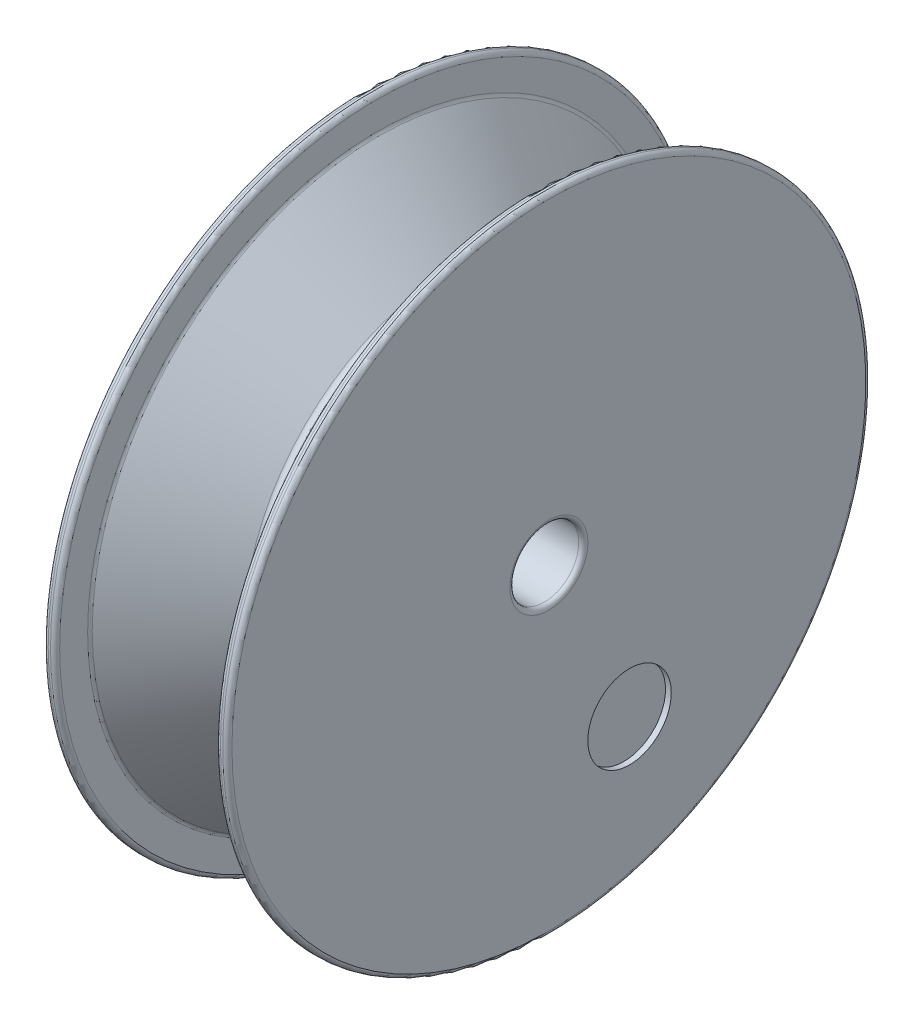
ISO-10303-21;
HEADER;
FILE_DESCRIPTION(('STEP AP214'),'2;1');
FILE_NAME('part.step','',(''),(''),'','','');
FILE_SCHEMA(('AUTOMOTIVE_DESIGN { 1 0 10303 214 1 1 1 1 }'));
ENDSEC;
DATA;
#1=APPLICATION_CONTEXT('core data for automotive mechanical design processes');
#2=APPLICATION_PROTOCOL_DEFINITION('international standard','automotive_design',2000,#1);
#3=PRODUCT_CONTEXT('',#1,'mechanical');
#4=PRODUCT('Part','Part','',(#3));
#5=PRODUCT_RELATED_PRODUCT_CATEGORY('part','',(#4));
#6=PRODUCT_DEFINITION_FORMATION('','',#4);
#7=PRODUCT_DEFINITION_CONTEXT('part definition',#1,'design');
#8=PRODUCT_DEFINITION('design','',#6,#7);
#9=PRODUCT_DEFINITION_SHAPE('','',#8);
#10=(LENGTH_UNIT() NAMED_UNIT(*) SI_UNIT(.MILLI.,.METRE.));
#11=(NAMED_UNIT(*) PLANE_ANGLE_UNIT() SI_UNIT($,.RADIAN.));
#12=(NAMED_UNIT(*) SI_UNIT($,.STERADIAN.) SOLID_ANGLE_UNIT());
#13=UNCERTAINTY_MEASURE_WITH_UNIT(LENGTH_MEASURE(1.E-05),#10,'distance_accuracy_value','');
#14=(GEOMETRIC_REPRESENTATION_CONTEXT(3) GLOBAL_UNCERTAINTY_ASSIGNED_CONTEXT((#13)) GLOBAL_UNIT_ASSIGNED_CONTEXT((#10,
#11,#12)) REPRESENTATION_CONTEXT('',''));
#15=CARTESIAN_POINT('',(0.,0.,0.));
#16=DIRECTION('',(0.,0.,1.));
#17=DIRECTION('',(1.,0.,0.));
#18=AXIS2_PLACEMENT_3D('',#15,#16,#17);
#19=CARTESIAN_POINT('',(0.,0.,0.));
#20=DIRECTION('',(-1.,0.,0.));
#21=DIRECTION('',(0.,0.,1.));
#22=AXIS2_PLACEMENT_3D('',#19,#20,#21);
#23=CYLINDRICAL_SURFACE('',#22,1.5);
#24=CARTESIAN_POINT('',(3.8,0.,0.));
#25=DIRECTION('',(-1.,0.,0.));
#26=DIRECTION('',(0.,0.,1.));
#27=AXIS2_PLACEMENT_3D('',#24,#25,#26);
#28=CIRCLE('',#27,1.5);
#29=CARTESIAN_POINT('',(3.8,0.,1.5));
#30=VERTEX_POINT('',#29);
#31=EDGE_CURVE('E41',#30,#30,#28,.F.);
#32=ORIENTED_EDGE('',*,*,#31,.T.);
#33=EDGE_LOOP('',(#32));
#34=FACE_BOUND('',#33,.T.);
#35=CARTESIAN_POINT('',(-3.8,0.,0.));
#36=DIRECTION('',(1.,0.,0.));
#37=DIRECTION('',(0.,0.,-1.));
#38=AXIS2_PLACEMENT_3D('',#35,#36,#37);
#39=CIRCLE('',#38,1.5);
#40=CARTESIAN_POINT('',(-3.8,0.,-1.5));
#41=VERTEX_POINT('',#40);
#42=EDGE_CURVE('E45',#41,#41,#39,.F.);
#43=ORIENTED_EDGE('',*,*,#42,.T.);
#44=EDGE_LOOP('',(#43));
#45=FACE_BOUND('',#44,.T.);
#46=ADVANCED_FACE('F31',(#34,#45),#23,.F.);
#47=CARTESIAN_POINT('',(-4.,1.5,0.));
#48=DIRECTION('',(1.,0.,0.));
#49=DIRECTION('',(0.,0.,-1.));
#50=AXIS2_PLACEMENT_3D('',#47,#48,#49);
#51=PLANE('',#50);
#52=CARTESIAN_POINT('',(-4.,0.,0.));
#53=DIRECTION('',(1.,0.,0.));
#54=DIRECTION('',(0.,0.,-1.));
#55=AXIS2_PLACEMENT_3D('',#52,#53,#54);
#56=CIRCLE('',#55,13.8);
#57=CARTESIAN_POINT('',(-4.,0.,-13.8));
#58=VERTEX_POINT('',#57);
#59=EDGE_CURVE('E10',#58,#58,#56,.F.);
#60=ORIENTED_EDGE('',*,*,#59,.T.);
#61=EDGE_LOOP('',(#60));
#62=FACE_BOUND('',#61,.T.);
#63=CARTESIAN_POINT('',(-4.,0.,0.));
#64=DIRECTION('',(1.,0.,0.));
#65=DIRECTION('',(0.,0.,-1.));
#66=AXIS2_PLACEMENT_3D('',#63,#64,#65);
#67=CIRCLE('',#66,1.7);
#68=CARTESIAN_POINT('',(-4.,0.,-1.7));
#69=VERTEX_POINT('',#68);
#70=EDGE_CURVE('E37',#69,#69,#67,.T.);
#71=ORIENTED_EDGE('',*,*,#70,.T.);
#72=EDGE_LOOP('',(#71));
#73=FACE_BOUND('',#72,.T.);
#74=ADVANCED_FACE('F130',(#62,#73),#51,.F.);
#75=CARTESIAN_POINT('',(0.,0.,0.));
#76=DIRECTION('',(-1.,0.,0.));
#77=DIRECTION('',(0.,0.,1.));
#78=AXIS2_PLACEMENT_3D('',#75,#76,#77);
#79=CYLINDRICAL_SURFACE('',#78,14.);
#80=CARTESIAN_POINT('',(-3.7,0.,0.));
#81=DIRECTION('',(-1.,0.,0.));
#82=DIRECTION('',(0.,0.,1.));
#83=AXIS2_PLACEMENT_3D('',#80,#81,#82);
#84=CIRCLE('',#83,14.);
#85=CARTESIAN_POINT('',(-3.7,0.,14.));
#86=VERTEX_POINT('',#85);
#87=EDGE_CURVE('E56',#86,#86,#84,.T.);
#88=ORIENTED_EDGE('',*,*,#87,.T.);
#89=EDGE_LOOP('',(#88));
#90=FACE_BOUND('',#89,.T.);
#91=CARTESIAN_POINT('',(-3.8,0.,0.));
#92=DIRECTION('',(1.,0.,0.));
#93=DIRECTION('',(0.,0.,-1.));
#94=AXIS2_PLACEMENT_3D('',#91,#92,#93);
#95=CIRCLE('',#94,14.);
#96=CARTESIAN_POINT('',(-3.8,0.,-14.));
#97=VERTEX_POINT('',#96);
#98=EDGE_CURVE('E59',#97,#97,#95,.T.);
#99=ORIENTED_EDGE('',*,*,#98,.T.);
#100=EDGE_LOOP('',(#99));
#101=FACE_BOUND('',#100,.T.);
#102=ADVANCED_FACE('F135',(#90,#101),#79,.T.);
#103=CARTESIAN_POINT('',(-3.5,14.,0.));
#104=DIRECTION('',(-1.,0.,0.));
#105=DIRECTION('',(0.,0.,1.));
#106=AXIS2_PLACEMENT_3D('',#103,#104,#105);
#107=PLANE('',#106);
#108=CARTESIAN_POINT('',(-3.5,0.,0.));
#109=DIRECTION('',(-1.,0.,0.));
#110=DIRECTION('',(0.,0.,1.));
#111=AXIS2_PLACEMENT_3D('',#108,#109,#110);
#112=CIRCLE('',#111,12.5828427124746);
#113=CARTESIAN_POINT('',(-3.5,0.,12.5828427124746));
#114=VERTEX_POINT('',#113);
#115=EDGE_CURVE('E62',#114,#114,#112,.T.);
#116=ORIENTED_EDGE('',*,*,#115,.T.);
#117=EDGE_LOOP('',(#116));
#118=FACE_BOUND('',#117,.T.);
#119=CARTESIAN_POINT('',(-3.5,0.,0.));
#120=DIRECTION('',(-1.,0.,0.));
#121=DIRECTION('',(0.,0.,1.));
#122=AXIS2_PLACEMENT_3D('',#119,#120,#121);
#123=CIRCLE('',#122,13.8);
#124=CARTESIAN_POINT('',(-3.5,0.,13.8));
#125=VERTEX_POINT('',#124);
#126=EDGE_CURVE('E65',#125,#125,#123,.F.);
#127=ORIENTED_EDGE('',*,*,#126,.T.);
#128=EDGE_LOOP('',(#127));
#129=FACE_BOUND('',#128,.T.);
#130=ADVANCED_FACE('F196',(#118,#129),#107,.F.);
#131=CARTESIAN_POINT('',(0.,0.,0.));
#132=DIRECTION('',(-1.,0.,0.));
#133=DIRECTION('',(0.,0.,1.));
#134=AXIS2_PLACEMENT_3D('',#131,#132,#133);
#135=CONICAL_SURFACE('',#134,9.,0.785398163397452);
#136=CARTESIAN_POINT('',(-0.141421356237334,0.,0.));
#137=DIRECTION('',(-1.,0.,0.));
#138=DIRECTION('',(0.,0.,1.));
#139=AXIS2_PLACEMENT_3D('',#136,#137,#138);
#140=CIRCLE('',#139,9.14142135623731);
#141=CARTESIAN_POINT('',(-0.141421356237334,0.,9.14142135623731));
#142=VERTEX_POINT('',#141);
#143=EDGE_CURVE('E68',#142,#142,#140,.T.);
#144=ORIENTED_EDGE('',*,*,#143,.T.);
#145=EDGE_LOOP('',(#144));
#146=FACE_BOUND('',#145,.T.);
#147=CARTESIAN_POINT('',(-3.44142135623731,0.,0.));
#148=DIRECTION('',(-1.,0.,0.));
#149=DIRECTION('',(0.,0.,1.));
#150=AXIS2_PLACEMENT_3D('',#147,#148,#149);
#151=CIRCLE('',#150,12.4414213562373);
#152=CARTESIAN_POINT('',(-3.44142135623731,0.,12.4414213562373));
#153=VERTEX_POINT('',#152);
#154=EDGE_CURVE('E71',#153,#153,#151,.F.);
#155=ORIENTED_EDGE('',*,*,#154,.T.);
#156=EDGE_LOOP('',(#155));
#157=FACE_BOUND('',#156,.T.);
#158=ADVANCED_FACE('F188',(#146,#157),#135,.T.);
#159=CARTESIAN_POINT('',(3.5,0.,0.));
#160=DIRECTION('',(1.,0.,0.));
#161=DIRECTION('',(0.,0.,-1.));
#162=AXIS2_PLACEMENT_3D('',#159,#160,#161);
#163=CONICAL_SURFACE('',#162,12.5,0.785398163397445);
#164=CARTESIAN_POINT('',(3.4414213562373,0.,0.));
#165=DIRECTION('',(1.,0.,0.));
#166=DIRECTION('',(0.,0.,-1.));
#167=AXIS2_PLACEMENT_3D('',#164,#165,#166);
#168=CIRCLE('',#167,12.4414213562373);
#169=CARTESIAN_POINT('',(3.4414213562373,0.,-12.4414213562373));
#170=VERTEX_POINT('',#169);
#171=EDGE_CURVE('E74',#170,#170,#168,.F.);
#172=ORIENTED_EDGE('',*,*,#171,.T.);
#173=EDGE_LOOP('',(#172));
#174=FACE_BOUND('',#173,.T.);
#175=CARTESIAN_POINT('',(0.141421356237285,0.,0.));
#176=DIRECTION('',(1.,0.,0.));
#177=DIRECTION('',(0.,0.,-1.));
#178=AXIS2_PLACEMENT_3D('',#175,#176,#177);
#179=CIRCLE('',#178,9.14142135623731);
#180=CARTESIAN_POINT('',(0.141421356237285,0.,-9.14142135623731));
#181=VERTEX_POINT('',#180);
#182=EDGE_CURVE('E77',#181,#181,#179,.T.);
#183=ORIENTED_EDGE('',*,*,#182,.T.);
#184=EDGE_LOOP('',(#183));
#185=FACE_BOUND('',#184,.T.);
#186=ADVANCED_FACE('F126',(#174,#185),#163,.T.);
#187=CARTESIAN_POINT('',(3.49999999999999,12.5,0.));
#188=DIRECTION('',(1.,0.,0.));
#189=DIRECTION('',(0.,0.,-1.));
#190=AXIS2_PLACEMENT_3D('',#187,#188,#189);
#191=PLANE('',#190);
#192=CARTESIAN_POINT('',(3.49999999999999,0.,0.));
#193=DIRECTION('',(1.,0.,0.));
#194=DIRECTION('',(0.,0.,-1.));
#195=AXIS2_PLACEMENT_3D('',#192,#193,#194);
#196=CIRCLE('',#195,13.8);
#197=CARTESIAN_POINT('',(3.49999999999999,0.,-13.8));
#198=VERTEX_POINT('',#197);
#199=EDGE_CURVE('E86',#198,#198,#196,.F.);
#200=ORIENTED_EDGE('',*,*,#199,.T.);
#201=EDGE_LOOP('',(#200));
#202=FACE_BOUND('',#201,.T.);
#203=CARTESIAN_POINT('',(3.49999999999999,0.,0.));
#204=DIRECTION('',(1.,0.,0.));
#205=DIRECTION('',(0.,0.,-1.));
#206=AXIS2_PLACEMENT_3D('',#203,#204,#205);
#207=CIRCLE('',#206,12.5828427124746);
#208=CARTESIAN_POINT('',(3.49999999999999,0.,-12.5828427124746));
#209=VERTEX_POINT('',#208);
#210=EDGE_CURVE('E89',#209,#209,#207,.T.);
#211=ORIENTED_EDGE('',*,*,#210,.T.);
#212=EDGE_LOOP('',(#211));
#213=FACE_BOUND('',#212,.T.);
#214=ADVANCED_FACE('F120',(#202,#213),#191,.F.);
#215=CARTESIAN_POINT('',(0.,0.,0.));
#216=DIRECTION('',(-1.,0.,0.));
#217=DIRECTION('',(0.,0.,1.));
#218=AXIS2_PLACEMENT_3D('',#215,#216,#217);
#219=CYLINDRICAL_SURFACE('',#218,14.);
#220=CARTESIAN_POINT('',(3.69999999999999,0.,0.));
#221=DIRECTION('',(1.,0.,0.));
#222=DIRECTION('',(0.,0.,-1.));
#223=AXIS2_PLACEMENT_3D('',#220,#221,#222);
#224=CIRCLE('',#223,14.);
#225=CARTESIAN_POINT('',(3.69999999999999,0.,-14.));
#226=VERTEX_POINT('',#225);
#227=EDGE_CURVE('E80',#226,#226,#224,.T.);
#228=ORIENTED_EDGE('',*,*,#227,.T.);
#229=EDGE_LOOP('',(#228));
#230=FACE_BOUND('',#229,.T.);
#231=CARTESIAN_POINT('',(3.8,0.,0.));
#232=DIRECTION('',(-1.,0.,0.));
#233=DIRECTION('',(0.,0.,1.));
#234=AXIS2_PLACEMENT_3D('',#231,#232,#233);
#235=CIRCLE('',#234,14.);
#236=CARTESIAN_POINT('',(3.8,0.,14.));
#237=VERTEX_POINT('',#236);
#238=EDGE_CURVE('E83',#237,#237,#235,.T.);
#239=ORIENTED_EDGE('',*,*,#238,.T.);
#240=EDGE_LOOP('',(#239));
#241=FACE_BOUND('',#240,.T.);
#242=ADVANCED_FACE('F105',(#230,#241),#219,.T.);
#243=CARTESIAN_POINT('',(4.,1.5,0.));
#244=DIRECTION('',(-1.,0.,0.));
#245=DIRECTION('',(0.,0.,1.));
#246=AXIS2_PLACEMENT_3D('',#243,#244,#245);
#247=PLANE('',#246);
#248=CARTESIAN_POINT('',(4.,-7.47256814744945,-3.51192559790203));
#249=DIRECTION('',(1.,0.,0.));
#250=DIRECTION('',(0.,0.,-1.));
#251=AXIS2_PLACEMENT_3D('',#248,#249,#250);
#252=CIRCLE('',#251,1.81728081720056);
#253=CARTESIAN_POINT('',(4.,-7.47256814744945,-5.32920641510259));
#254=VERTEX_POINT('',#253);
#255=EDGE_CURVE('E95',#254,#254,#252,.T.);
#256=ORIENTED_EDGE('',*,*,#255,.F.);
#257=EDGE_LOOP('',(#256));
#258=FACE_BOUND('',#257,.T.);
#259=CARTESIAN_POINT('',(4.,0.,0.));
#260=DIRECTION('',(-1.,0.,0.));
#261=DIRECTION('',(0.,0.,1.));
#262=AXIS2_PLACEMENT_3D('',#259,#260,#261);
#263=CIRCLE('',#262,1.7);
#264=CARTESIAN_POINT('',(4.,0.,1.7));
#265=VERTEX_POINT('',#264);
#266=EDGE_CURVE('E50',#265,#265,#263,.T.);
#267=ORIENTED_EDGE('',*,*,#266,.T.);
#268=EDGE_LOOP('',(#267));
#269=FACE_BOUND('',#268,.T.);
#270=CARTESIAN_POINT('',(4.,0.,0.));
#271=DIRECTION('',(-1.,0.,0.));
#272=DIRECTION('',(0.,0.,1.));
#273=AXIS2_PLACEMENT_3D('',#270,#271,#272);
#274=CIRCLE('',#273,13.8);
#275=CARTESIAN_POINT('',(4.,0.,13.8));
#276=VERTEX_POINT('',#275);
#277=EDGE_CURVE('E53',#276,#276,#274,.F.);
#278=ORIENTED_EDGE('',*,*,#277,.T.);
#279=EDGE_LOOP('',(#278));
#280=FACE_BOUND('',#279,.T.);
#281=ADVANCED_FACE('F101',(#258,#269,#280),#247,.F.);
#282=CARTESIAN_POINT('',(3.69999999999999,0.,0.));
#283=DIRECTION('',(1.,0.,0.));
#284=DIRECTION('',(0.,0.,-1.));
#285=AXIS2_PLACEMENT_3D('',#282,#283,#284);
#286=TOROIDAL_SURFACE('',#285,13.8,0.2);
#287=ORIENTED_EDGE('',*,*,#227,.F.);
#288=EDGE_LOOP('',(#287));
#289=FACE_BOUND('',#288,.T.);
#290=ORIENTED_EDGE('',*,*,#199,.F.);
#291=EDGE_LOOP('',(#290));
#292=FACE_BOUND('',#291,.T.);
#293=ADVANCED_FACE('F104',(#289,#292),#286,.T.);
#294=CARTESIAN_POINT('',(3.29999999999999,0.,0.));
#295=DIRECTION('',(1.,0.,0.));
#296=DIRECTION('',(0.,0.,-1.));
#297=AXIS2_PLACEMENT_3D('',#294,#295,#296);
#298=TOROIDAL_SURFACE('',#297,12.5828427124746,0.2);
#299=ORIENTED_EDGE('',*,*,#210,.F.);
#300=EDGE_LOOP('',(#299));
#301=FACE_BOUND('',#300,.T.);
#302=ORIENTED_EDGE('',*,*,#171,.F.);
#303=EDGE_LOOP('',(#302));
#304=FACE_BOUND('',#303,.T.);
#305=ADVANCED_FACE('F169',(#301,#304),#298,.F.);
#306=CARTESIAN_POINT('',(0.,0.,0.));
#307=DIRECTION('',(-1.,0.,0.));
#308=DIRECTION('',(0.,0.,1.));
#309=AXIS2_PLACEMENT_3D('',#306,#307,#308);
#310=TOROIDAL_SURFACE('',#309,9.28284271247462,0.2);
#311=ORIENTED_EDGE('',*,*,#182,.F.);
#312=EDGE_LOOP('',(#311));
#313=FACE_BOUND('',#312,.T.);
#314=ORIENTED_EDGE('',*,*,#143,.F.);
#315=EDGE_LOOP('',(#314));
#316=FACE_BOUND('',#315,.T.);
#317=ADVANCED_FACE('F165',(#313,#316),#310,.F.);
#318=CARTESIAN_POINT('',(-3.3,0.,0.));
#319=DIRECTION('',(-1.,0.,0.));
#320=DIRECTION('',(0.,0.,1.));
#321=AXIS2_PLACEMENT_3D('',#318,#319,#320);
#322=TOROIDAL_SURFACE('',#321,12.5828427124746,0.2);
#323=ORIENTED_EDGE('',*,*,#154,.F.);
#324=EDGE_LOOP('',(#323));
#325=FACE_BOUND('',#324,.T.);
#326=ORIENTED_EDGE('',*,*,#115,.F.);
#327=EDGE_LOOP('',(#326));
#328=FACE_BOUND('',#327,.T.);
#329=ADVANCED_FACE('F161',(#325,#328),#322,.F.);
#330=CARTESIAN_POINT('',(-3.7,0.,0.));
#331=DIRECTION('',(-1.,0.,0.));
#332=DIRECTION('',(0.,0.,1.));
#333=AXIS2_PLACEMENT_3D('',#330,#331,#332);
#334=TOROIDAL_SURFACE('',#333,13.8,0.2);
#335=ORIENTED_EDGE('',*,*,#126,.F.);
#336=EDGE_LOOP('',(#335));
#337=FACE_BOUND('',#336,.T.);
#338=ORIENTED_EDGE('',*,*,#87,.F.);
#339=EDGE_LOOP('',(#338));
#340=FACE_BOUND('',#339,.T.);
#341=ADVANCED_FACE('F157',(#337,#340),#334,.T.);
#342=CARTESIAN_POINT('',(3.8,0.,0.));
#343=DIRECTION('',(-1.,0.,0.));
#344=DIRECTION('',(0.,0.,1.));
#345=AXIS2_PLACEMENT_3D('',#342,#343,#344);
#346=TOROIDAL_SURFACE('',#345,1.7,0.2);
#347=ORIENTED_EDGE('',*,*,#31,.F.);
#348=EDGE_LOOP('',(#347));
#349=FACE_BOUND('',#348,.T.);
#350=ORIENTED_EDGE('',*,*,#266,.F.);
#351=EDGE_LOOP('',(#350));
#352=FACE_BOUND('',#351,.T.);
#353=ADVANCED_FACE('F115',(#349,#352),#346,.T.);
#354=CARTESIAN_POINT('',(3.8,0.,0.));
#355=DIRECTION('',(-1.,0.,0.));
#356=DIRECTION('',(0.,0.,1.));
#357=AXIS2_PLACEMENT_3D('',#354,#355,#356);
#358=TOROIDAL_SURFACE('',#357,13.8,0.2);
#359=ORIENTED_EDGE('',*,*,#277,.F.);
#360=EDGE_LOOP('',(#359));
#361=FACE_BOUND('',#360,.T.);
#362=ORIENTED_EDGE('',*,*,#238,.F.);
#363=EDGE_LOOP('',(#362));
#364=FACE_BOUND('',#363,.T.);
#365=ADVANCED_FACE('F111',(#361,#364),#358,.T.);
#366=CARTESIAN_POINT('',(-3.8,0.,0.));
#367=DIRECTION('',(1.,0.,0.));
#368=DIRECTION('',(0.,0.,-1.));
#369=AXIS2_PLACEMENT_3D('',#366,#367,#368);
#370=TOROIDAL_SURFACE('',#369,13.8,0.2);
#371=ORIENTED_EDGE('',*,*,#98,.F.);
#372=EDGE_LOOP('',(#371));
#373=FACE_BOUND('',#372,.T.);
#374=ORIENTED_EDGE('',*,*,#59,.F.);
#375=EDGE_LOOP('',(#374));
#376=FACE_BOUND('',#375,.T.);
#377=ADVANCED_FACE('F114',(#373,#376),#370,.T.);
#378=CARTESIAN_POINT('',(-3.8,0.,0.));
#379=DIRECTION('',(1.,0.,0.));
#380=DIRECTION('',(0.,0.,-1.));
#381=AXIS2_PLACEMENT_3D('',#378,#379,#380);
#382=TOROIDAL_SURFACE('',#381,1.7,0.2);
#383=ORIENTED_EDGE('',*,*,#70,.F.);
#384=EDGE_LOOP('',(#383));
#385=FACE_BOUND('',#384,.T.);
#386=ORIENTED_EDGE('',*,*,#42,.F.);
#387=EDGE_LOOP('',(#386));
#388=FACE_BOUND('',#387,.T.);
#389=ADVANCED_FACE('F140',(#385,#388),#382,.T.);
#390=CARTESIAN_POINT('',(3.75,-7.47256814744945,-3.51192559790203));
#391=DIRECTION('',(1.,0.,0.));
#392=DIRECTION('',(0.,0.,-1.));
#393=AXIS2_PLACEMENT_3D('',#390,#391,#392);
#394=CYLINDRICAL_SURFACE('',#393,1.81728081720056);
#395=CARTESIAN_POINT('',(3.75,-7.47256814744945,-3.51192559790203));
#396=DIRECTION('',(1.,0.,0.));
#397=DIRECTION('',(0.,0.,-1.));
#398=AXIS2_PLACEMENT_3D('',#395,#396,#397);
#399=CIRCLE('',#398,1.81728081720056);
#400=CARTESIAN_POINT('',(3.75,-7.47256814744945,-5.32920641510259));
#401=VERTEX_POINT('',#400);
#402=EDGE_CURVE('E92',#401,#401,#399,.T.);
#403=ORIENTED_EDGE('',*,*,#402,.F.);
#404=EDGE_LOOP('',(#403));
#405=FACE_BOUND('',#404,.T.);
#406=ORIENTED_EDGE('',*,*,#255,.T.);
#407=EDGE_LOOP('',(#406));
#408=FACE_BOUND('',#407,.T.);
#409=ADVANCED_FACE('F99',(#405,#408),#394,.F.);
#410=CARTESIAN_POINT('',(3.75,-7.47256814744945,-3.51192559790203));
#411=DIRECTION('',(1.,0.,0.));
#412=DIRECTION('',(0.,0.,-1.));
#413=AXIS2_PLACEMENT_3D('',#410,#411,#412);
#414=PLANE('',#413);
#415=ORIENTED_EDGE('',*,*,#402,.T.);
#416=EDGE_LOOP('',(#415));
#417=FACE_BOUND('',#416,.T.);
#418=ADVANCED_FACE('F148',(#417),#414,.T.);
#419=CLOSED_SHELL('',(#46,#74,#102,#130,#158,#186,#214,#242,#281,#293,#305,#317,#329,#341,#353,
#365,#377,#389,#409,#418));
#420=MANIFOLD_SOLID_BREP('B2',#419);
#421=ADVANCED_BREP_SHAPE_REPRESENTATION('',(#18,#420),#14);
#422=SHAPE_DEFINITION_REPRESENTATION(#9,#421);
ENDSEC;
END-ISO-10303-21;
